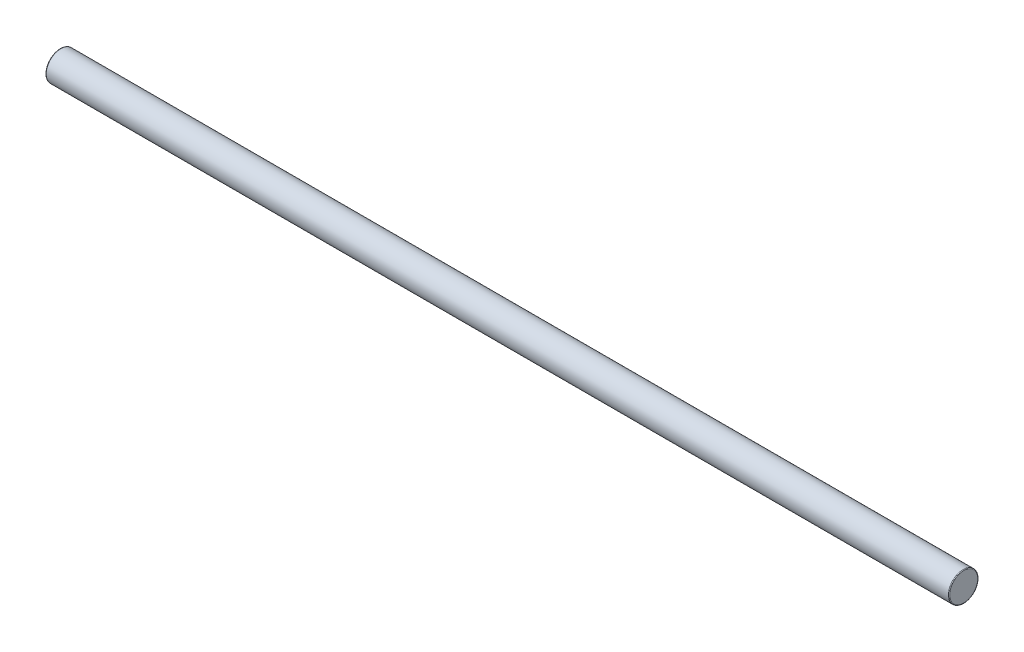
ISO-10303-21;
HEADER;
FILE_DESCRIPTION(('STEP AP214'),'2;1');
FILE_NAME('part.step','',(''),(''),'','','');
FILE_SCHEMA(('AUTOMOTIVE_DESIGN { 1 0 10303 214 1 1 1 1 }'));
ENDSEC;
DATA;
#1=APPLICATION_CONTEXT('core data for automotive mechanical design processes');
#2=APPLICATION_PROTOCOL_DEFINITION('international standard','automotive_design',2000,#1);
#3=PRODUCT_CONTEXT('',#1,'mechanical');
#4=PRODUCT('Part','Part','',(#3));
#5=PRODUCT_RELATED_PRODUCT_CATEGORY('part','',(#4));
#6=PRODUCT_DEFINITION_FORMATION('','',#4);
#7=PRODUCT_DEFINITION_CONTEXT('part definition',#1,'design');
#8=PRODUCT_DEFINITION('design','',#6,#7);
#9=PRODUCT_DEFINITION_SHAPE('','',#8);
#10=(LENGTH_UNIT() NAMED_UNIT(*) SI_UNIT(.MILLI.,.METRE.));
#11=(NAMED_UNIT(*) PLANE_ANGLE_UNIT() SI_UNIT($,.RADIAN.));
#12=(NAMED_UNIT(*) SI_UNIT($,.STERADIAN.) SOLID_ANGLE_UNIT());
#13=UNCERTAINTY_MEASURE_WITH_UNIT(LENGTH_MEASURE(1.E-05),#10,'distance_accuracy_value','');
#14=(GEOMETRIC_REPRESENTATION_CONTEXT(3) GLOBAL_UNCERTAINTY_ASSIGNED_CONTEXT((#13)) GLOBAL_UNIT_ASSIGNED_CONTEXT((#10,
#11,#12)) REPRESENTATION_CONTEXT('',''));
#15=CARTESIAN_POINT('',(0.,0.,0.));
#16=DIRECTION('',(0.,0.,1.));
#17=DIRECTION('',(1.,0.,0.));
#18=AXIS2_PLACEMENT_3D('',#15,#16,#17);
#19=CARTESIAN_POINT('',(1952.752,0.,0.));
#20=DIRECTION('',(-1.,0.,0.));
#21=DIRECTION('',(0.,0.,1.));
#22=AXIS2_PLACEMENT_3D('',#19,#20,#21);
#23=CYLINDRICAL_SURFACE('',#22,31.73095);
#24=CARTESIAN_POINT('',(1951.228,0.,0.));
#25=DIRECTION('',(1.,0.,0.));
#26=DIRECTION('',(0.,0.,-1.));
#27=AXIS2_PLACEMENT_3D('',#24,#25,#26);
#28=CIRCLE('',#27,31.73095);
#29=CARTESIAN_POINT('',(1951.228,0.,-31.73095));
#30=VERTEX_POINT('',#29);
#31=EDGE_CURVE('E44',#30,#30,#28,.F.);
#32=ORIENTED_EDGE('',*,*,#31,.T.);
#33=EDGE_LOOP('',(#32));
#34=FACE_BOUND('',#33,.T.);
#35=CARTESIAN_POINT('',(1.52400000000008,0.,0.));
#36=DIRECTION('',(1.,0.,0.));
#37=DIRECTION('',(0.,0.,-1.));
#38=AXIS2_PLACEMENT_3D('',#35,#36,#37);
#39=CIRCLE('',#38,31.73095);
#40=CARTESIAN_POINT('',(1.52400000000008,0.,-31.73095));
#41=VERTEX_POINT('',#40);
#42=EDGE_CURVE('E48',#41,#41,#39,.T.);
#43=ORIENTED_EDGE('',*,*,#42,.T.);
#44=EDGE_LOOP('',(#43));
#45=FACE_BOUND('',#44,.T.);
#46=ADVANCED_FACE('F37',(#34,#45),#23,.T.);
#47=CARTESIAN_POINT('',(1952.752,0.,0.));
#48=DIRECTION('',(1.,0.,0.));
#49=DIRECTION('',(0.,0.,-1.));
#50=AXIS2_PLACEMENT_3D('',#47,#48,#49);
#51=PLANE('',#50);
#52=CARTESIAN_POINT('',(1952.752,0.,0.));
#53=DIRECTION('',(1.,0.,0.));
#54=DIRECTION('',(0.,0.,-1.));
#55=AXIS2_PLACEMENT_3D('',#52,#53,#54);
#56=CIRCLE('',#55,30.20695);
#57=CARTESIAN_POINT('',(1952.752,0.,-30.20695));
#58=VERTEX_POINT('',#57);
#59=EDGE_CURVE('E52',#58,#58,#56,.T.);
#60=ORIENTED_EDGE('',*,*,#59,.T.);
#61=EDGE_LOOP('',(#60));
#62=FACE_BOUND('',#61,.T.);
#63=ADVANCED_FACE('F58',(#62),#51,.T.);
#64=CARTESIAN_POINT('',(0.,0.,0.));
#65=DIRECTION('',(1.,0.,0.));
#66=DIRECTION('',(0.,0.,-1.));
#67=AXIS2_PLACEMENT_3D('',#64,#65,#66);
#68=PLANE('',#67);
#69=CARTESIAN_POINT('',(0.,0.,0.));
#70=DIRECTION('',(1.,0.,0.));
#71=DIRECTION('',(0.,0.,-1.));
#72=AXIS2_PLACEMENT_3D('',#69,#70,#71);
#73=CIRCLE('',#72,30.20695);
#74=CARTESIAN_POINT('',(0.,0.,-30.20695));
#75=VERTEX_POINT('',#74);
#76=EDGE_CURVE('E10',#75,#75,#73,.F.);
#77=ORIENTED_EDGE('',*,*,#76,.T.);
#78=EDGE_LOOP('',(#77));
#79=FACE_BOUND('',#78,.T.);
#80=ADVANCED_FACE('F62',(#79),#68,.F.);
#81=CARTESIAN_POINT('',(1951.228,0.,0.));
#82=DIRECTION('',(1.,0.,0.));
#83=DIRECTION('',(0.,0.,-1.));
#84=AXIS2_PLACEMENT_3D('',#81,#82,#83);
#85=TOROIDAL_SURFACE('',#84,30.20695,1.524);
#86=ORIENTED_EDGE('',*,*,#31,.F.);
#87=EDGE_LOOP('',(#86));
#88=FACE_BOUND('',#87,.T.);
#89=ORIENTED_EDGE('',*,*,#59,.F.);
#90=EDGE_LOOP('',(#89));
#91=FACE_BOUND('',#90,.T.);
#92=ADVANCED_FACE('F60',(#88,#91),#85,.T.);
#93=CARTESIAN_POINT('',(1.52400000000008,0.,0.));
#94=DIRECTION('',(1.,0.,0.));
#95=DIRECTION('',(0.,0.,-1.));
#96=AXIS2_PLACEMENT_3D('',#93,#94,#95);
#97=TOROIDAL_SURFACE('',#96,30.20695,1.524);
#98=ORIENTED_EDGE('',*,*,#76,.F.);
#99=EDGE_LOOP('',(#98));
#100=FACE_BOUND('',#99,.T.);
#101=ORIENTED_EDGE('',*,*,#42,.F.);
#102=EDGE_LOOP('',(#101));
#103=FACE_BOUND('',#102,.T.);
#104=ADVANCED_FACE('F39',(#100,#103),#97,.T.);
#105=CLOSED_SHELL('',(#46,#63,#80,#92,#104));
#106=MANIFOLD_SOLID_BREP('B2',#105);
#107=ADVANCED_BREP_SHAPE_REPRESENTATION('',(#18,#106),#14);
#108=SHAPE_DEFINITION_REPRESENTATION(#9,#107);
ENDSEC;
END-ISO-10303-21;
